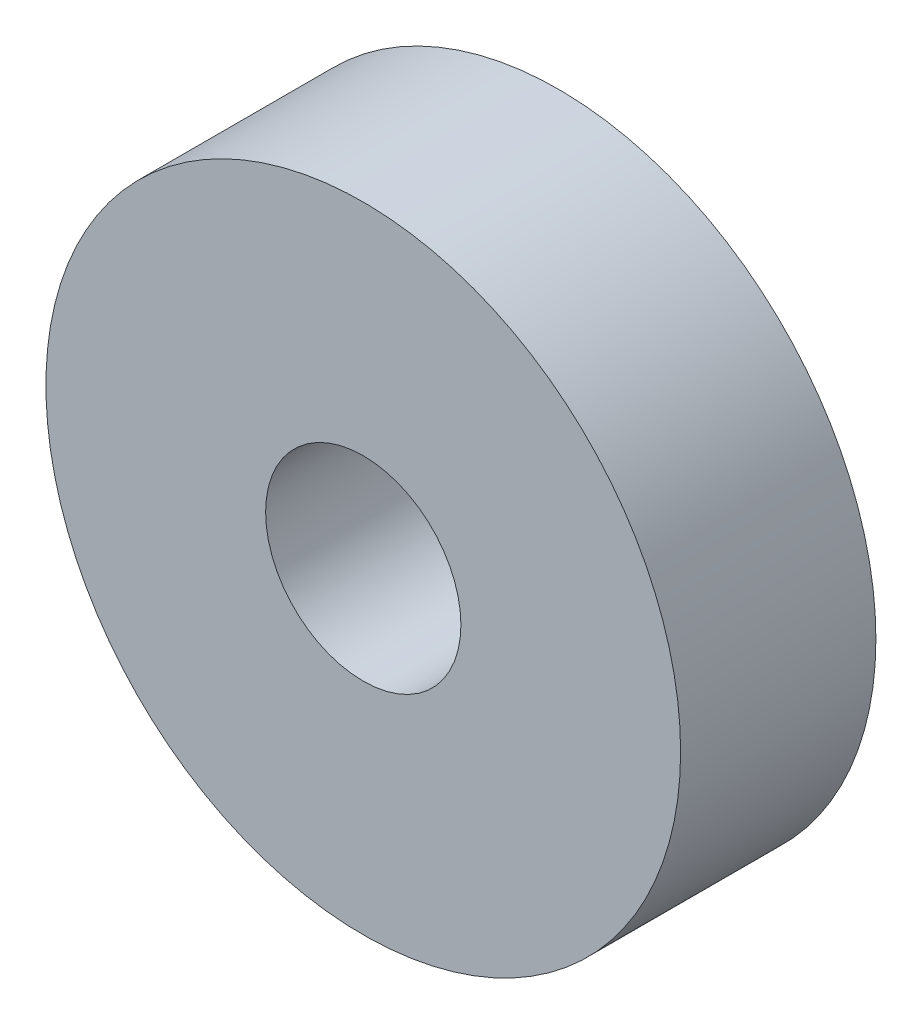
ISO-10303-21;
HEADER;
FILE_DESCRIPTION(('STEP AP214'),'2;1');
FILE_NAME('part.step','',(''),(''),'','','');
FILE_SCHEMA(('AUTOMOTIVE_DESIGN { 1 0 10303 214 1 1 1 1 }'));
ENDSEC;
DATA;
#1=APPLICATION_CONTEXT('core data for automotive mechanical design processes');
#2=APPLICATION_PROTOCOL_DEFINITION('international standard','automotive_design',2000,#1);
#3=PRODUCT_CONTEXT('',#1,'mechanical');
#4=PRODUCT('Part','Part','',(#3));
#5=PRODUCT_RELATED_PRODUCT_CATEGORY('part','',(#4));
#6=PRODUCT_DEFINITION_FORMATION('','',#4);
#7=PRODUCT_DEFINITION_CONTEXT('part definition',#1,'design');
#8=PRODUCT_DEFINITION('design','',#6,#7);
#9=PRODUCT_DEFINITION_SHAPE('','',#8);
#10=(LENGTH_UNIT() NAMED_UNIT(*) SI_UNIT(.MILLI.,.METRE.));
#11=(NAMED_UNIT(*) PLANE_ANGLE_UNIT() SI_UNIT($,.RADIAN.));
#12=(NAMED_UNIT(*) SI_UNIT($,.STERADIAN.) SOLID_ANGLE_UNIT());
#13=UNCERTAINTY_MEASURE_WITH_UNIT(LENGTH_MEASURE(1.E-05),#10,'distance_accuracy_value','');
#14=(GEOMETRIC_REPRESENTATION_CONTEXT(3) GLOBAL_UNCERTAINTY_ASSIGNED_CONTEXT((#13)) GLOBAL_UNIT_ASSIGNED_CONTEXT((#10,
#11,#12)) REPRESENTATION_CONTEXT('',''));
#15=CARTESIAN_POINT('',(0.,0.,0.));
#16=DIRECTION('',(0.,0.,1.));
#17=DIRECTION('',(1.,0.,0.));
#18=AXIS2_PLACEMENT_3D('',#15,#16,#17);
#19=CARTESIAN_POINT('',(0.,0.,4.));
#20=DIRECTION('',(0.,0.,1.));
#21=DIRECTION('',(1.,0.,0.));
#22=AXIS2_PLACEMENT_3D('',#19,#20,#21);
#23=PLANE('',#22);
#24=CARTESIAN_POINT('',(0.,0.,4.));
#25=DIRECTION('',(0.,0.,1.));
#26=DIRECTION('',(1.,0.,0.));
#27=AXIS2_PLACEMENT_3D('',#24,#25,#26);
#28=CIRCLE('',#27,6.5);
#29=CARTESIAN_POINT('',(6.5,0.,4.));
#30=VERTEX_POINT('',#29);
#31=EDGE_CURVE('E10',#30,#30,#28,.T.);
#32=ORIENTED_EDGE('',*,*,#31,.T.);
#33=EDGE_LOOP('',(#32));
#34=FACE_BOUND('',#33,.T.);
#35=CARTESIAN_POINT('',(0.,0.,4.));
#36=DIRECTION('',(0.,0.,1.));
#37=DIRECTION('',(1.,0.,0.));
#38=AXIS2_PLACEMENT_3D('',#35,#36,#37);
#39=CIRCLE('',#38,2.);
#40=CARTESIAN_POINT('',(2.,0.,4.));
#41=VERTEX_POINT('',#40);
#42=EDGE_CURVE('E46',#41,#41,#39,.T.);
#43=ORIENTED_EDGE('',*,*,#42,.F.);
#44=EDGE_LOOP('',(#43));
#45=FACE_BOUND('',#44,.T.);
#46=ADVANCED_FACE('F35',(#34,#45),#23,.T.);
#47=CARTESIAN_POINT('',(0.,0.,0.));
#48=DIRECTION('',(0.,0.,1.));
#49=DIRECTION('',(1.,0.,0.));
#50=AXIS2_PLACEMENT_3D('',#47,#48,#49);
#51=PLANE('',#50);
#52=CARTESIAN_POINT('',(0.,0.,0.));
#53=DIRECTION('',(0.,0.,1.));
#54=DIRECTION('',(1.,0.,0.));
#55=AXIS2_PLACEMENT_3D('',#52,#53,#54);
#56=CIRCLE('',#55,6.5);
#57=CARTESIAN_POINT('',(6.5,0.,0.));
#58=VERTEX_POINT('',#57);
#59=EDGE_CURVE('E39',#58,#58,#56,.T.);
#60=ORIENTED_EDGE('',*,*,#59,.F.);
#61=EDGE_LOOP('',(#60));
#62=FACE_BOUND('',#61,.T.);
#63=CARTESIAN_POINT('',(0.,0.,0.));
#64=DIRECTION('',(0.,0.,1.));
#65=DIRECTION('',(1.,0.,0.));
#66=AXIS2_PLACEMENT_3D('',#63,#64,#65);
#67=CIRCLE('',#66,2.);
#68=CARTESIAN_POINT('',(2.,0.,0.));
#69=VERTEX_POINT('',#68);
#70=EDGE_CURVE('E48',#69,#69,#67,.T.);
#71=ORIENTED_EDGE('',*,*,#70,.T.);
#72=EDGE_LOOP('',(#71));
#73=FACE_BOUND('',#72,.T.);
#74=ADVANCED_FACE('F58',(#62,#73),#51,.F.);
#75=CARTESIAN_POINT('',(0.,0.,4.));
#76=DIRECTION('',(0.,0.,-1.));
#77=DIRECTION('',(-1.,0.,0.));
#78=AXIS2_PLACEMENT_3D('',#75,#76,#77);
#79=CYLINDRICAL_SURFACE('',#78,6.5);
#80=ORIENTED_EDGE('',*,*,#31,.F.);
#81=EDGE_LOOP('',(#80));
#82=FACE_BOUND('',#81,.T.);
#83=ORIENTED_EDGE('',*,*,#59,.T.);
#84=EDGE_LOOP('',(#83));
#85=FACE_BOUND('',#84,.T.);
#86=ADVANCED_FACE('F37',(#82,#85),#79,.T.);
#87=CARTESIAN_POINT('',(0.,0.,4.));
#88=DIRECTION('',(0.,0.,-1.));
#89=DIRECTION('',(-1.,0.,0.));
#90=AXIS2_PLACEMENT_3D('',#87,#88,#89);
#91=CYLINDRICAL_SURFACE('',#90,2.);
#92=ORIENTED_EDGE('',*,*,#42,.T.);
#93=EDGE_LOOP('',(#92));
#94=FACE_BOUND('',#93,.T.);
#95=ORIENTED_EDGE('',*,*,#70,.F.);
#96=EDGE_LOOP('',(#95));
#97=FACE_BOUND('',#96,.T.);
#98=ADVANCED_FACE('F54',(#94,#97),#91,.F.);
#99=CLOSED_SHELL('',(#46,#74,#86,#98));
#100=MANIFOLD_SOLID_BREP('B2',#99);
#101=ADVANCED_BREP_SHAPE_REPRESENTATION('',(#18,#100),#14);
#102=SHAPE_DEFINITION_REPRESENTATION(#9,#101);
ENDSEC;
END-ISO-10303-21;
